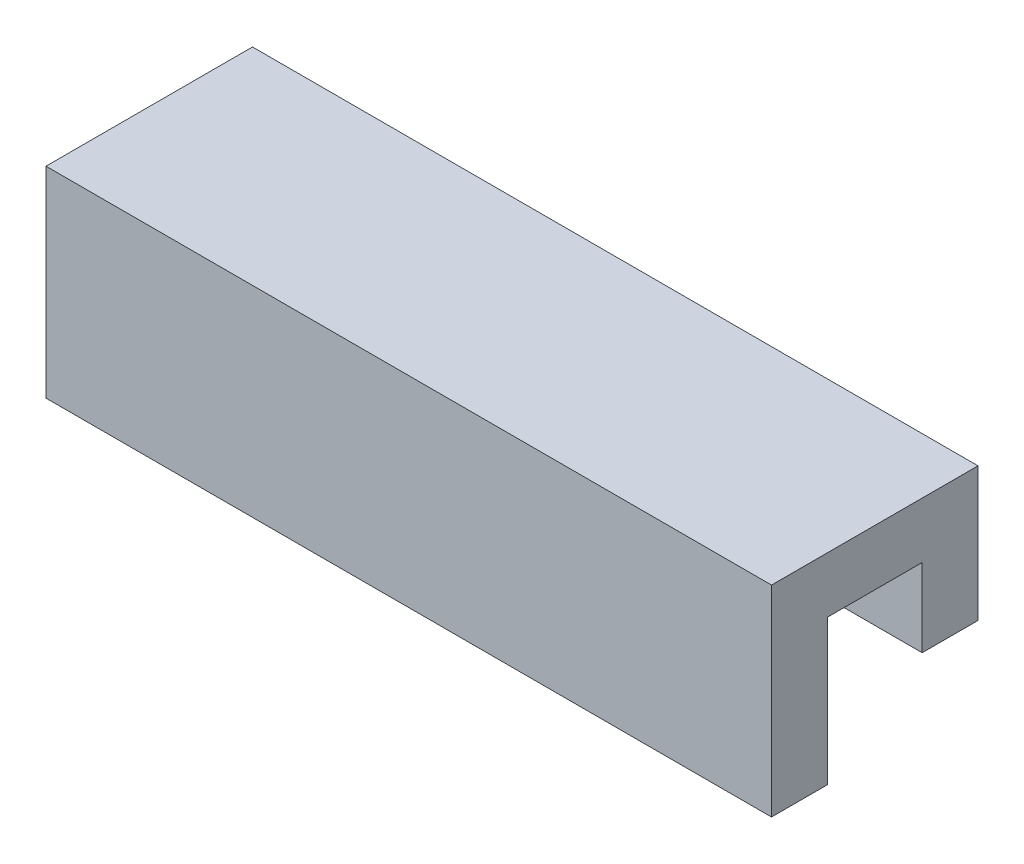
ISO-10303-21;
HEADER;
FILE_DESCRIPTION(('STEP AP214'),'2;1');
FILE_NAME('part.step','',(''),(''),'','','');
FILE_SCHEMA(('AUTOMOTIVE_DESIGN { 1 0 10303 214 1 1 1 1 }'));
ENDSEC;
DATA;
#1=APPLICATION_CONTEXT('core data for automotive mechanical design processes');
#2=APPLICATION_PROTOCOL_DEFINITION('international standard','automotive_design',2000,#1);
#3=PRODUCT_CONTEXT('',#1,'mechanical');
#4=PRODUCT('Part','Part','',(#3));
#5=PRODUCT_RELATED_PRODUCT_CATEGORY('part','',(#4));
#6=PRODUCT_DEFINITION_FORMATION('','',#4);
#7=PRODUCT_DEFINITION_CONTEXT('part definition',#1,'design');
#8=PRODUCT_DEFINITION('design','',#6,#7);
#9=PRODUCT_DEFINITION_SHAPE('','',#8);
#10=(LENGTH_UNIT() NAMED_UNIT(*) SI_UNIT(.MILLI.,.METRE.));
#11=(NAMED_UNIT(*) PLANE_ANGLE_UNIT() SI_UNIT($,.RADIAN.));
#12=(NAMED_UNIT(*) SI_UNIT($,.STERADIAN.) SOLID_ANGLE_UNIT());
#13=UNCERTAINTY_MEASURE_WITH_UNIT(LENGTH_MEASURE(1.E-05),#10,'distance_accuracy_value','');
#14=(GEOMETRIC_REPRESENTATION_CONTEXT(3) GLOBAL_UNCERTAINTY_ASSIGNED_CONTEXT((#13)) GLOBAL_UNIT_ASSIGNED_CONTEXT((#10,
#11,#12)) REPRESENTATION_CONTEXT('',''));
#15=CARTESIAN_POINT('',(0.,0.,0.));
#16=DIRECTION('',(0.,0.,1.));
#17=DIRECTION('',(1.,0.,0.));
#18=AXIS2_PLACEMENT_3D('',#15,#16,#17);
#19=CARTESIAN_POINT('',(-65.,-18.,37.));
#20=DIRECTION('',(1.,0.,0.));
#21=DIRECTION('',(0.,0.,-1.));
#22=AXIS2_PLACEMENT_3D('',#19,#20,#21);
#23=PLANE('',#22);
#24=DIRECTION('',(0.,-1.,0.));
#25=VECTOR('',#24,1.);
#26=CARTESIAN_POINT('',(-65.,-18.,0.));
#27=LINE('',#26,#25);
#28=CARTESIAN_POINT('',(-65.,18.,0.));
#29=VERTEX_POINT('',#28);
#30=CARTESIAN_POINT('',(-65.,-6.,0.));
#31=VERTEX_POINT('',#30);
#32=EDGE_CURVE('E117',#29,#31,#27,.T.);
#33=ORIENTED_EDGE('',*,*,#32,.T.);
#34=DIRECTION('',(0.,0.,1.));
#35=VECTOR('',#34,1.);
#36=CARTESIAN_POINT('',(-65.,-6.,0.));
#37=LINE('',#36,#35);
#38=CARTESIAN_POINT('',(-65.,-6.,10.0064436202073));
#39=VERTEX_POINT('',#38);
#40=EDGE_CURVE('E98',#31,#39,#37,.T.);
#41=ORIENTED_EDGE('',*,*,#40,.T.);
#42=DIRECTION('',(0.,-1.,0.));
#43=VECTOR('',#42,1.);
#44=CARTESIAN_POINT('',(-65.,8.,10.0064436202073));
#45=LINE('',#44,#43);
#46=CARTESIAN_POINT('',(-65.,8.,10.0064436202073));
#47=VERTEX_POINT('',#46);
#48=EDGE_CURVE('E121',#47,#39,#45,.T.);
#49=ORIENTED_EDGE('',*,*,#48,.F.);
#50=DIRECTION('',(0.,0.,1.));
#51=VECTOR('',#50,1.);
#52=CARTESIAN_POINT('',(-65.,8.,37.));
#53=LINE('',#52,#51);
#54=CARTESIAN_POINT('',(-65.,8.,27.0064436202073));
#55=VERTEX_POINT('',#54);
#56=EDGE_CURVE('E147',#47,#55,#53,.T.);
#57=ORIENTED_EDGE('',*,*,#56,.T.);
#58=DIRECTION('',(0.,-1.,0.));
#59=VECTOR('',#58,1.);
#60=CARTESIAN_POINT('',(-65.,8.,27.0064436202073));
#61=LINE('',#60,#59);
#62=CARTESIAN_POINT('',(-65.,-18.,27.0064436202073));
#63=VERTEX_POINT('',#62);
#64=EDGE_CURVE('E145',#55,#63,#61,.T.);
#65=ORIENTED_EDGE('',*,*,#64,.T.);
#66=DIRECTION('',(0.,0.,-1.));
#67=VECTOR('',#66,1.);
#68=CARTESIAN_POINT('',(-65.,-18.,37.));
#69=LINE('',#68,#67);
#70=CARTESIAN_POINT('',(-65.,-18.,37.));
#71=VERTEX_POINT('',#70);
#72=EDGE_CURVE('E40',#71,#63,#69,.T.);
#73=ORIENTED_EDGE('',*,*,#72,.F.);
#74=DIRECTION('',(0.,-1.,0.));
#75=VECTOR('',#74,1.);
#76=CARTESIAN_POINT('',(-65.,-18.,37.));
#77=LINE('',#76,#75);
#78=CARTESIAN_POINT('',(-65.,18.,37.));
#79=VERTEX_POINT('',#78);
#80=EDGE_CURVE('E119',#79,#71,#77,.T.);
#81=ORIENTED_EDGE('',*,*,#80,.F.);
#82=DIRECTION('',(0.,0.,-1.));
#83=VECTOR('',#82,1.);
#84=CARTESIAN_POINT('',(-65.,18.,37.));
#85=LINE('',#84,#83);
#86=EDGE_CURVE('E125',#79,#29,#85,.T.);
#87=ORIENTED_EDGE('',*,*,#86,.T.);
#88=EDGE_LOOP('',(#33,#41,#49,#57,#65,#73,#81,#87));
#89=FACE_BOUND('',#88,.T.);
#90=ADVANCED_FACE('F33',(#89),#23,.F.);
#91=CARTESIAN_POINT('',(65.,-18.,37.));
#92=DIRECTION('',(0.,1.,0.));
#93=DIRECTION('',(-1.,0.,0.));
#94=AXIS2_PLACEMENT_3D('',#91,#92,#93);
#95=PLANE('',#94);
#96=DIRECTION('',(1.,0.,0.));
#97=VECTOR('',#96,1.);
#98=CARTESIAN_POINT('',(65.,-18.,27.0064436202073));
#99=LINE('',#98,#97);
#100=CARTESIAN_POINT('',(65.,-18.,27.0064436202073));
#101=VERTEX_POINT('',#100);
#102=EDGE_CURVE('E103',#63,#101,#99,.T.);
#103=ORIENTED_EDGE('',*,*,#102,.T.);
#104=DIRECTION('',(0.,0.,-1.));
#105=VECTOR('',#104,1.);
#106=CARTESIAN_POINT('',(65.,-18.,37.));
#107=LINE('',#106,#105);
#108=CARTESIAN_POINT('',(65.,-18.,37.));
#109=VERTEX_POINT('',#108);
#110=EDGE_CURVE('E131',#109,#101,#107,.T.);
#111=ORIENTED_EDGE('',*,*,#110,.F.);
#112=DIRECTION('',(1.,0.,0.));
#113=VECTOR('',#112,1.);
#114=CARTESIAN_POINT('',(65.,-18.,37.));
#115=LINE('',#114,#113);
#116=EDGE_CURVE('E139',#71,#109,#115,.T.);
#117=ORIENTED_EDGE('',*,*,#116,.F.);
#118=ORIENTED_EDGE('',*,*,#72,.T.);
#119=EDGE_LOOP('',(#103,#111,#117,#118));
#120=FACE_BOUND('',#119,.T.);
#121=ADVANCED_FACE('F137',(#120),#95,.F.);
#122=CARTESIAN_POINT('',(65.,-18.,37.));
#123=DIRECTION('',(-1.,0.,0.));
#124=DIRECTION('',(0.,0.,1.));
#125=AXIS2_PLACEMENT_3D('',#122,#123,#124);
#126=PLANE('',#125);
#127=DIRECTION('',(0.,-1.,0.));
#128=VECTOR('',#127,1.);
#129=CARTESIAN_POINT('',(65.,8.00000000000001,10.0064436202073));
#130=LINE('',#129,#128);
#131=CARTESIAN_POINT('',(65.,8.00000000000001,10.0064436202073));
#132=VERTEX_POINT('',#131);
#133=CARTESIAN_POINT('',(65.,-5.99999999999999,10.0064436202073));
#134=VERTEX_POINT('',#133);
#135=EDGE_CURVE('E112',#132,#134,#130,.T.);
#136=ORIENTED_EDGE('',*,*,#135,.T.);
#137=DIRECTION('',(0.,0.,-1.));
#138=VECTOR('',#137,1.);
#139=CARTESIAN_POINT('',(65.,-6.,0.));
#140=LINE('',#139,#138);
#141=CARTESIAN_POINT('',(65.,-6.,0.));
#142=VERTEX_POINT('',#141);
#143=EDGE_CURVE('E46',#134,#142,#140,.T.);
#144=ORIENTED_EDGE('',*,*,#143,.T.);
#145=DIRECTION('',(0.,1.,0.));
#146=VECTOR('',#145,1.);
#147=CARTESIAN_POINT('',(65.,-18.,0.));
#148=LINE('',#147,#146);
#149=CARTESIAN_POINT('',(65.,18.,0.));
#150=VERTEX_POINT('',#149);
#151=EDGE_CURVE('E109',#142,#150,#148,.T.);
#152=ORIENTED_EDGE('',*,*,#151,.T.);
#153=DIRECTION('',(0.,0.,-1.));
#154=VECTOR('',#153,1.);
#155=CARTESIAN_POINT('',(65.,18.,37.));
#156=LINE('',#155,#154);
#157=CARTESIAN_POINT('',(65.,18.,37.));
#158=VERTEX_POINT('',#157);
#159=EDGE_CURVE('E128',#158,#150,#156,.T.);
#160=ORIENTED_EDGE('',*,*,#159,.F.);
#161=DIRECTION('',(0.,1.,0.));
#162=VECTOR('',#161,1.);
#163=CARTESIAN_POINT('',(65.,-18.,37.));
#164=LINE('',#163,#162);
#165=EDGE_CURVE('E159',#109,#158,#164,.T.);
#166=ORIENTED_EDGE('',*,*,#165,.F.);
#167=ORIENTED_EDGE('',*,*,#110,.T.);
#168=DIRECTION('',(0.,-1.,0.));
#169=VECTOR('',#168,1.);
#170=CARTESIAN_POINT('',(65.,8.00000000000001,27.0064436202073));
#171=LINE('',#170,#169);
#172=CARTESIAN_POINT('',(65.,8.00000000000001,27.0064436202073));
#173=VERTEX_POINT('',#172);
#174=EDGE_CURVE('E150',#173,#101,#171,.T.);
#175=ORIENTED_EDGE('',*,*,#174,.F.);
#176=DIRECTION('',(0.,0.,-1.));
#177=VECTOR('',#176,1.);
#178=CARTESIAN_POINT('',(65.,8.00000000000001,37.));
#179=LINE('',#178,#177);
#180=EDGE_CURVE('E176',#173,#132,#179,.T.);
#181=ORIENTED_EDGE('',*,*,#180,.T.);
#182=EDGE_LOOP('',(#136,#144,#152,#160,#166,#167,#175,#181));
#183=FACE_BOUND('',#182,.T.);
#184=ADVANCED_FACE('F107',(#183),#126,.F.);
#185=CARTESIAN_POINT('',(65.,18.,37.));
#186=DIRECTION('',(0.,-1.,0.));
#187=DIRECTION('',(1.,0.,0.));
#188=AXIS2_PLACEMENT_3D('',#185,#186,#187);
#189=PLANE('',#188);
#190=DIRECTION('',(-1.,0.,0.));
#191=VECTOR('',#190,1.);
#192=CARTESIAN_POINT('',(65.,18.,0.));
#193=LINE('',#192,#191);
#194=EDGE_CURVE('E116',#150,#29,#193,.T.);
#195=ORIENTED_EDGE('',*,*,#194,.T.);
#196=ORIENTED_EDGE('',*,*,#86,.F.);
#197=DIRECTION('',(-1.,0.,0.));
#198=VECTOR('',#197,1.);
#199=CARTESIAN_POINT('',(65.,18.,37.));
#200=LINE('',#199,#198);
#201=EDGE_CURVE('E129',#158,#79,#200,.T.);
#202=ORIENTED_EDGE('',*,*,#201,.F.);
#203=ORIENTED_EDGE('',*,*,#159,.T.);
#204=EDGE_LOOP('',(#195,#196,#202,#203));
#205=FACE_BOUND('',#204,.T.);
#206=ADVANCED_FACE('F166',(#205),#189,.F.);
#207=CARTESIAN_POINT('',(0.,0.,37.));
#208=DIRECTION('',(0.,0.,1.));
#209=DIRECTION('',(1.,0.,0.));
#210=AXIS2_PLACEMENT_3D('',#207,#208,#209);
#211=PLANE('',#210);
#212=ORIENTED_EDGE('',*,*,#80,.T.);
#213=ORIENTED_EDGE('',*,*,#116,.T.);
#214=ORIENTED_EDGE('',*,*,#165,.T.);
#215=ORIENTED_EDGE('',*,*,#201,.T.);
#216=EDGE_LOOP('',(#212,#213,#214,#215));
#217=FACE_BOUND('',#216,.T.);
#218=ADVANCED_FACE('F163',(#217),#211,.T.);
#219=CARTESIAN_POINT('',(0.,0.,0.));
#220=DIRECTION('',(0.,0.,1.));
#221=DIRECTION('',(1.,0.,0.));
#222=AXIS2_PLACEMENT_3D('',#219,#220,#221);
#223=PLANE('',#222);
#224=ORIENTED_EDGE('',*,*,#151,.F.);
#225=DIRECTION('',(-1.,0.,0.));
#226=VECTOR('',#225,1.);
#227=CARTESIAN_POINT('',(-65.,-6.,0.));
#228=LINE('',#227,#226);
#229=EDGE_CURVE('E95',#142,#31,#228,.T.);
#230=ORIENTED_EDGE('',*,*,#229,.T.);
#231=ORIENTED_EDGE('',*,*,#32,.F.);
#232=ORIENTED_EDGE('',*,*,#194,.F.);
#233=EDGE_LOOP('',(#224,#230,#231,#232));
#234=FACE_BOUND('',#233,.T.);
#235=ADVANCED_FACE('F115',(#234),#223,.F.);
#236=CARTESIAN_POINT('',(65.,8.00000000000001,10.0064436202073));
#237=DIRECTION('',(0.,0.,1.));
#238=DIRECTION('',(1.,0.,0.));
#239=AXIS2_PLACEMENT_3D('',#236,#237,#238);
#240=PLANE('',#239);
#241=DIRECTION('',(-1.,0.,0.));
#242=VECTOR('',#241,1.);
#243=CARTESIAN_POINT('',(65.,-6.,10.0064436202073));
#244=LINE('',#243,#242);
#245=EDGE_CURVE('E11',#134,#39,#244,.T.);
#246=ORIENTED_EDGE('',*,*,#245,.F.);
#247=ORIENTED_EDGE('',*,*,#135,.F.);
#248=DIRECTION('',(-1.,0.,0.));
#249=VECTOR('',#248,1.);
#250=CARTESIAN_POINT('',(65.,8.00000000000001,10.0064436202073));
#251=LINE('',#250,#249);
#252=EDGE_CURVE('E54',#132,#47,#251,.T.);
#253=ORIENTED_EDGE('',*,*,#252,.T.);
#254=ORIENTED_EDGE('',*,*,#48,.T.);
#255=EDGE_LOOP('',(#246,#247,#253,#254));
#256=FACE_BOUND('',#255,.T.);
#257=ADVANCED_FACE('F169',(#256),#240,.T.);
#258=CARTESIAN_POINT('',(65.,8.00000000000001,27.0064436202073));
#259=DIRECTION('',(0.,0.,-1.));
#260=DIRECTION('',(-1.,0.,0.));
#261=AXIS2_PLACEMENT_3D('',#258,#259,#260);
#262=PLANE('',#261);
#263=ORIENTED_EDGE('',*,*,#102,.F.);
#264=ORIENTED_EDGE('',*,*,#64,.F.);
#265=DIRECTION('',(1.,0.,0.));
#266=VECTOR('',#265,1.);
#267=CARTESIAN_POINT('',(65.,8.00000000000001,27.0064436202073));
#268=LINE('',#267,#266);
#269=EDGE_CURVE('E171',#55,#173,#268,.T.);
#270=ORIENTED_EDGE('',*,*,#269,.T.);
#271=ORIENTED_EDGE('',*,*,#174,.T.);
#272=EDGE_LOOP('',(#263,#264,#270,#271));
#273=FACE_BOUND('',#272,.T.);
#274=ADVANCED_FACE('F179',(#273),#262,.T.);
#275=CARTESIAN_POINT('',(0.,8.,0.));
#276=DIRECTION('',(0.,1.,0.));
#277=DIRECTION('',(-1.,0.,0.));
#278=AXIS2_PLACEMENT_3D('',#275,#276,#277);
#279=PLANE('',#278);
#280=ORIENTED_EDGE('',*,*,#252,.F.);
#281=ORIENTED_EDGE('',*,*,#180,.F.);
#282=ORIENTED_EDGE('',*,*,#269,.F.);
#283=ORIENTED_EDGE('',*,*,#56,.F.);
#284=EDGE_LOOP('',(#280,#281,#282,#283));
#285=FACE_BOUND('',#284,.T.);
#286=ADVANCED_FACE('F178',(#285),#279,.F.);
#287=CARTESIAN_POINT('',(0.,-6.,0.));
#288=DIRECTION('',(0.,1.,0.));
#289=DIRECTION('',(0.,0.,1.));
#290=AXIS2_PLACEMENT_3D('',#287,#288,#289);
#291=PLANE('',#290);
#292=ORIENTED_EDGE('',*,*,#245,.T.);
#293=ORIENTED_EDGE('',*,*,#40,.F.);
#294=ORIENTED_EDGE('',*,*,#229,.F.);
#295=ORIENTED_EDGE('',*,*,#143,.F.);
#296=EDGE_LOOP('',(#292,#293,#294,#295));
#297=FACE_BOUND('',#296,.T.);
#298=ADVANCED_FACE('F96',(#297),#291,.F.);
#299=CLOSED_SHELL('',(#90,#121,#184,#206,#218,#235,#257,#274,#286,#298));
#300=MANIFOLD_SOLID_BREP('B2',#299);
#301=ADVANCED_BREP_SHAPE_REPRESENTATION('',(#18,#300),#14);
#302=SHAPE_DEFINITION_REPRESENTATION(#9,#301);
ENDSEC;
END-ISO-10303-21;
